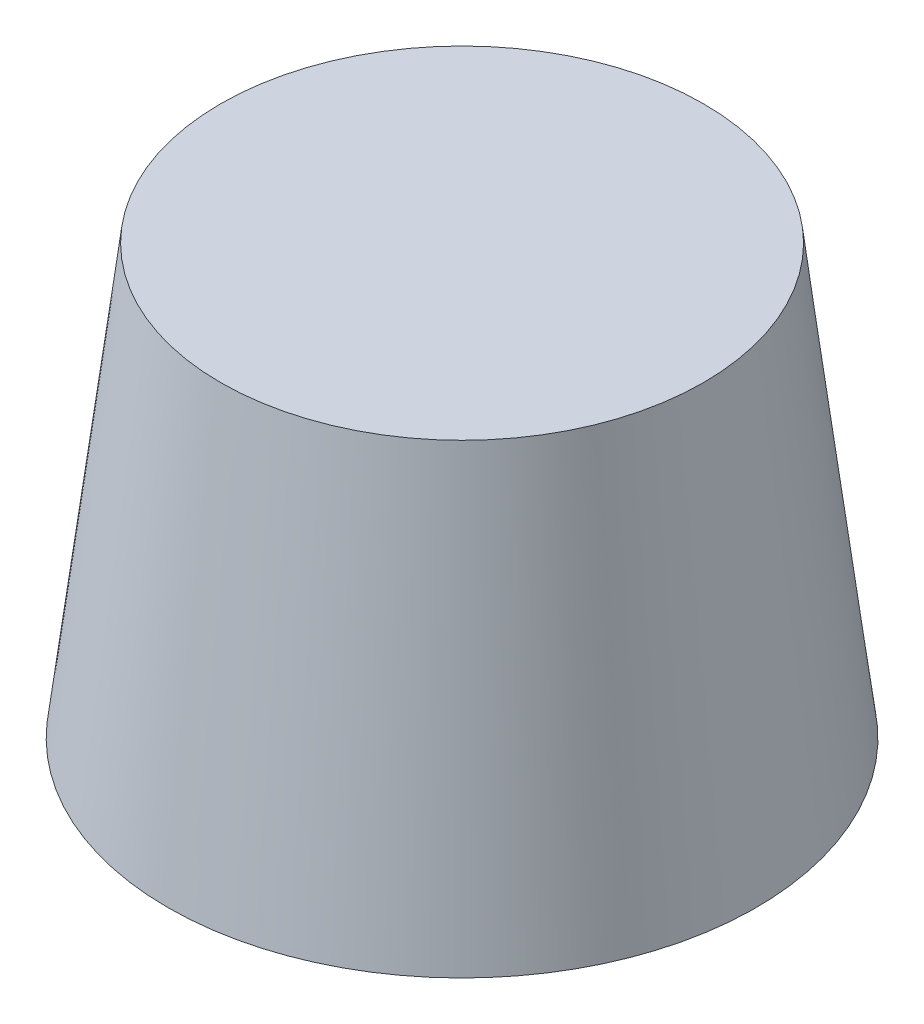
ISO-10303-21;
HEADER;
FILE_DESCRIPTION(('STEP AP214'),'2;1');
FILE_NAME('part.step','',(''),(''),'','','');
FILE_SCHEMA(('AUTOMOTIVE_DESIGN { 1 0 10303 214 1 1 1 1 }'));
ENDSEC;
DATA;
#1=APPLICATION_CONTEXT('core data for automotive mechanical design processes');
#2=APPLICATION_PROTOCOL_DEFINITION('international standard','automotive_design',2000,#1);
#3=PRODUCT_CONTEXT('',#1,'mechanical');
#4=PRODUCT('Part','Part','',(#3));
#5=PRODUCT_RELATED_PRODUCT_CATEGORY('part','',(#4));
#6=PRODUCT_DEFINITION_FORMATION('','',#4);
#7=PRODUCT_DEFINITION_CONTEXT('part definition',#1,'design');
#8=PRODUCT_DEFINITION('design','',#6,#7);
#9=PRODUCT_DEFINITION_SHAPE('','',#8);
#10=(LENGTH_UNIT() NAMED_UNIT(*) SI_UNIT(.MILLI.,.METRE.));
#11=(NAMED_UNIT(*) PLANE_ANGLE_UNIT() SI_UNIT($,.RADIAN.));
#12=(NAMED_UNIT(*) SI_UNIT($,.STERADIAN.) SOLID_ANGLE_UNIT());
#13=UNCERTAINTY_MEASURE_WITH_UNIT(LENGTH_MEASURE(1.E-05),#10,'distance_accuracy_value','');
#14=(GEOMETRIC_REPRESENTATION_CONTEXT(3) GLOBAL_UNCERTAINTY_ASSIGNED_CONTEXT((#13)) GLOBAL_UNIT_ASSIGNED_CONTEXT((#10,
#11,#12)) REPRESENTATION_CONTEXT('',''));
#15=CARTESIAN_POINT('',(0.,0.,0.));
#16=DIRECTION('',(0.,0.,1.));
#17=DIRECTION('',(1.,0.,0.));
#18=AXIS2_PLACEMENT_3D('',#15,#16,#17);
#19=CARTESIAN_POINT('',(0.,0.,0.));
#20=DIRECTION('',(0.,-1.,0.));
#21=DIRECTION('',(0.,0.,1.));
#22=AXIS2_PLACEMENT_3D('',#19,#20,#21);
#23=CONICAL_SURFACE('',#22,7.9375,0.122173047639603);
#24=CARTESIAN_POINT('',(0.,-6.35,0.));
#25=DIRECTION('',(0.,1.,0.));
#26=DIRECTION('',(0.,0.,1.));
#27=AXIS2_PLACEMENT_3D('',#24,#25,#26);
#28=CIRCLE('',#27,8.71718196173344);
#29=CARTESIAN_POINT('',(0.,-6.35,8.71718196173344));
#30=VERTEX_POINT('',#29);
#31=EDGE_CURVE('E10',#30,#30,#28,.T.);
#32=ORIENTED_EDGE('',*,*,#31,.T.);
#33=EDGE_LOOP('',(#32));
#34=FACE_BOUND('',#33,.T.);
#35=CARTESIAN_POINT('',(0.,6.35,0.));
#36=DIRECTION('',(0.,1.,0.));
#37=DIRECTION('',(0.,0.,1.));
#38=AXIS2_PLACEMENT_3D('',#35,#36,#37);
#39=CIRCLE('',#38,7.15781803826656);
#40=CARTESIAN_POINT('',(0.,6.35,7.15781803826656));
#41=VERTEX_POINT('',#40);
#42=EDGE_CURVE('E43',#41,#41,#39,.T.);
#43=ORIENTED_EDGE('',*,*,#42,.F.);
#44=EDGE_LOOP('',(#43));
#45=FACE_BOUND('',#44,.T.);
#46=ADVANCED_FACE('F40',(#34,#45),#23,.T.);
#47=CARTESIAN_POINT('',(0.,-6.35,0.));
#48=DIRECTION('',(0.,1.,0.));
#49=DIRECTION('',(0.,0.,1.));
#50=AXIS2_PLACEMENT_3D('',#47,#48,#49);
#51=PLANE('',#50);
#52=ORIENTED_EDGE('',*,*,#31,.F.);
#53=EDGE_LOOP('',(#52));
#54=FACE_BOUND('',#53,.T.);
#55=ADVANCED_FACE('F55',(#54),#51,.F.);
#56=CARTESIAN_POINT('',(0.,6.35,0.));
#57=DIRECTION('',(0.,1.,0.));
#58=DIRECTION('',(0.,0.,1.));
#59=AXIS2_PLACEMENT_3D('',#56,#57,#58);
#60=PLANE('',#59);
#61=ORIENTED_EDGE('',*,*,#42,.T.);
#62=EDGE_LOOP('',(#61));
#63=FACE_BOUND('',#62,.T.);
#64=ADVANCED_FACE('F47',(#63),#60,.T.);
#65=CLOSED_SHELL('',(#46,#55,#64));
#66=MANIFOLD_SOLID_BREP('B2',#65);
#67=ADVANCED_BREP_SHAPE_REPRESENTATION('',(#18,#66),#14);
#68=SHAPE_DEFINITION_REPRESENTATION(#9,#67);
ENDSEC;
END-ISO-10303-21;
